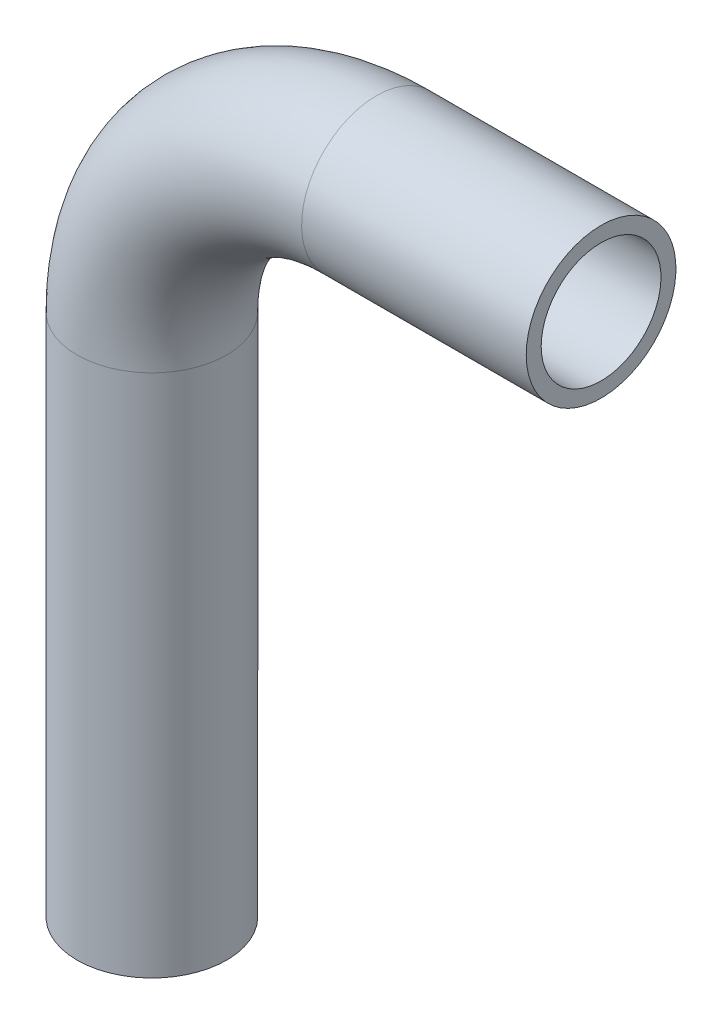
ISO-10303-21;
HEADER;
FILE_DESCRIPTION(('STEP AP214'),'2;1');
FILE_NAME('part.step','',(''),(''),'','','');
FILE_SCHEMA(('AUTOMOTIVE_DESIGN { 1 0 10303 214 1 1 1 1 }'));
ENDSEC;
DATA;
#1=APPLICATION_CONTEXT('core data for automotive mechanical design processes');
#2=APPLICATION_PROTOCOL_DEFINITION('international standard','automotive_design',2000,#1);
#3=PRODUCT_CONTEXT('',#1,'mechanical');
#4=PRODUCT('Part','Part','',(#3));
#5=PRODUCT_RELATED_PRODUCT_CATEGORY('part','',(#4));
#6=PRODUCT_DEFINITION_FORMATION('','',#4);
#7=PRODUCT_DEFINITION_CONTEXT('part definition',#1,'design');
#8=PRODUCT_DEFINITION('design','',#6,#7);
#9=PRODUCT_DEFINITION_SHAPE('','',#8);
#10=(LENGTH_UNIT() NAMED_UNIT(*) SI_UNIT(.MILLI.,.METRE.));
#11=(NAMED_UNIT(*) PLANE_ANGLE_UNIT() SI_UNIT($,.RADIAN.));
#12=(NAMED_UNIT(*) SI_UNIT($,.STERADIAN.) SOLID_ANGLE_UNIT());
#13=UNCERTAINTY_MEASURE_WITH_UNIT(LENGTH_MEASURE(1.E-05),#10,'distance_accuracy_value','');
#14=(GEOMETRIC_REPRESENTATION_CONTEXT(3) GLOBAL_UNCERTAINTY_ASSIGNED_CONTEXT((#13)) GLOBAL_UNIT_ASSIGNED_CONTEXT((#10,
#11,#12)) REPRESENTATION_CONTEXT('',''));
#15=CARTESIAN_POINT('',(0.,0.,0.));
#16=DIRECTION('',(0.,0.,1.));
#17=DIRECTION('',(1.,0.,0.));
#18=AXIS2_PLACEMENT_3D('',#15,#16,#17);
#19=CARTESIAN_POINT('',(0.,0.,0.));
#20=DIRECTION('',(0.,1.,0.));
#21=DIRECTION('',(0.,0.,1.));
#22=AXIS2_PLACEMENT_3D('',#19,#20,#21);
#23=CYLINDRICAL_SURFACE('',#22,12.7);
#24=CARTESIAN_POINT('',(0.,88.9,0.));
#25=DIRECTION('',(0.,1.,0.));
#26=DIRECTION('',(0.,0.,1.));
#27=AXIS2_PLACEMENT_3D('',#24,#25,#26);
#28=CIRCLE('',#27,12.7);
#29=CARTESIAN_POINT('',(-12.7,88.9,0.));
#30=VERTEX_POINT('',#29);
#31=EDGE_CURVE('E58',#30,#30,#28,.T.);
#32=ORIENTED_EDGE('',*,*,#31,.F.);
#33=EDGE_LOOP('',(#32));
#34=FACE_BOUND('',#33,.T.);
#35=CARTESIAN_POINT('',(0.,0.,0.));
#36=DIRECTION('',(0.,1.,0.));
#37=DIRECTION('',(0.,0.,1.));
#38=AXIS2_PLACEMENT_3D('',#35,#36,#37);
#39=CIRCLE('',#38,12.7);
#40=CARTESIAN_POINT('',(0.,0.,12.7));
#41=VERTEX_POINT('',#40);
#42=EDGE_CURVE('E56',#41,#41,#39,.T.);
#43=ORIENTED_EDGE('',*,*,#42,.T.);
#44=EDGE_LOOP('',(#43));
#45=FACE_BOUND('',#44,.T.);
#46=ADVANCED_FACE('F35',(#34,#45),#23,.T.);
#47=CARTESIAN_POINT('',(38.1,88.9,0.));
#48=DIRECTION('',(0.,0.,-1.));
#49=DIRECTION('',(-1.,0.,0.));
#50=AXIS2_PLACEMENT_3D('',#47,#48,#49);
#51=TOROIDAL_SURFACE('',#50,38.1,12.7);
#52=CARTESIAN_POINT('',(38.1,127.,0.));
#53=DIRECTION('',(1.,0.,0.));
#54=DIRECTION('',(0.,0.,1.));
#55=AXIS2_PLACEMENT_3D('',#52,#53,#54);
#56=CIRCLE('',#55,12.7);
#57=CARTESIAN_POINT('',(38.1,139.7,0.));
#58=VERTEX_POINT('',#57);
#59=EDGE_CURVE('E39',#58,#58,#56,.T.);
#60=CARTESIAN_POINT('',(38.1,88.9,0.));
#61=DIRECTION('',(0.,0.,-1.));
#62=DIRECTION('',(-1.,0.,0.));
#63=AXIS2_PLACEMENT_3D('',#60,#61,#62);
#64=CIRCLE('',#63,50.8);
#65=EDGE_CURVE('',#30,#58,#64,.T.);
#66=ORIENTED_EDGE('',*,*,#31,.T.);
#67=ORIENTED_EDGE('',*,*,#59,.F.);
#68=ORIENTED_EDGE('',*,*,#65,.T.);
#69=ORIENTED_EDGE('',*,*,#65,.F.);
#70=EDGE_LOOP('',(#66,#68,#67,#69));
#71=FACE_BOUND('',#70,.T.);
#72=ADVANCED_FACE('F66',(#71),#51,.T.);
#73=CARTESIAN_POINT('',(38.1,127.,0.));
#74=DIRECTION('',(1.,0.,0.));
#75=DIRECTION('',(0.,0.,-1.));
#76=AXIS2_PLACEMENT_3D('',#73,#74,#75);
#77=CYLINDRICAL_SURFACE('',#76,12.7);
#78=CARTESIAN_POINT('',(76.2,127.,0.));
#79=DIRECTION('',(1.,0.,0.));
#80=DIRECTION('',(0.,0.,1.));
#81=AXIS2_PLACEMENT_3D('',#78,#79,#80);
#82=CIRCLE('',#81,12.7);
#83=CARTESIAN_POINT('',(76.2,127.,12.7));
#84=VERTEX_POINT('',#83);
#85=EDGE_CURVE('E52',#84,#84,#82,.T.);
#86=ORIENTED_EDGE('',*,*,#85,.F.);
#87=EDGE_LOOP('',(#86));
#88=FACE_BOUND('',#87,.T.);
#89=ORIENTED_EDGE('',*,*,#59,.T.);
#90=EDGE_LOOP('',(#89));
#91=FACE_BOUND('',#90,.T.);
#92=ADVANCED_FACE('F37',(#88,#91),#77,.T.);
#93=CARTESIAN_POINT('',(0.,0.,0.));
#94=DIRECTION('',(0.,1.,0.));
#95=DIRECTION('',(0.,0.,1.));
#96=AXIS2_PLACEMENT_3D('',#93,#94,#95);
#97=PLANE('',#96);
#98=CARTESIAN_POINT('',(0.,0.,0.));
#99=DIRECTION('',(0.,1.,0.));
#100=DIRECTION('',(0.,0.,1.));
#101=AXIS2_PLACEMENT_3D('',#98,#99,#100);
#102=CIRCLE('',#101,10.16);
#103=CARTESIAN_POINT('',(0.,0.,10.16));
#104=VERTEX_POINT('',#103);
#105=EDGE_CURVE('E55',#104,#104,#102,.F.);
#106=ORIENTED_EDGE('',*,*,#105,.F.);
#107=EDGE_LOOP('',(#106));
#108=FACE_BOUND('',#107,.T.);
#109=ORIENTED_EDGE('',*,*,#42,.F.);
#110=EDGE_LOOP('',(#109));
#111=FACE_BOUND('',#110,.T.);
#112=ADVANCED_FACE('F72',(#108,#111),#97,.F.);
#113=CARTESIAN_POINT('',(76.2,127.,0.));
#114=DIRECTION('',(1.,0.,0.));
#115=DIRECTION('',(0.,0.,1.));
#116=AXIS2_PLACEMENT_3D('',#113,#114,#115);
#117=PLANE('',#116);
#118=CARTESIAN_POINT('',(76.2,127.,0.));
#119=DIRECTION('',(1.,0.,0.));
#120=DIRECTION('',(0.,0.,1.));
#121=AXIS2_PLACEMENT_3D('',#118,#119,#120);
#122=CIRCLE('',#121,10.16);
#123=CARTESIAN_POINT('',(76.2,127.,10.16));
#124=VERTEX_POINT('',#123);
#125=EDGE_CURVE('E10',#124,#124,#122,.F.);
#126=ORIENTED_EDGE('',*,*,#125,.T.);
#127=EDGE_LOOP('',(#126));
#128=FACE_BOUND('',#127,.T.);
#129=ORIENTED_EDGE('',*,*,#85,.T.);
#130=EDGE_LOOP('',(#129));
#131=FACE_BOUND('',#130,.T.);
#132=ADVANCED_FACE('F90',(#128,#131),#117,.T.);
#133=CARTESIAN_POINT('',(0.,0.,0.));
#134=DIRECTION('',(0.,1.,0.));
#135=DIRECTION('',(0.,0.,1.));
#136=AXIS2_PLACEMENT_3D('',#133,#134,#135);
#137=CYLINDRICAL_SURFACE('',#136,10.16);
#138=CARTESIAN_POINT('',(0.,88.9,0.));
#139=DIRECTION('',(0.,1.,0.));
#140=DIRECTION('',(0.,0.,1.));
#141=AXIS2_PLACEMENT_3D('',#138,#139,#140);
#142=CIRCLE('',#141,10.16);
#143=CARTESIAN_POINT('',(-10.16,88.9,0.));
#144=VERTEX_POINT('',#143);
#145=EDGE_CURVE('E48',#144,#144,#142,.F.);
#146=ORIENTED_EDGE('',*,*,#145,.F.);
#147=EDGE_LOOP('',(#146));
#148=FACE_BOUND('',#147,.T.);
#149=ORIENTED_EDGE('',*,*,#105,.T.);
#150=EDGE_LOOP('',(#149));
#151=FACE_BOUND('',#150,.T.);
#152=ADVANCED_FACE('F84',(#148,#151),#137,.F.);
#153=CARTESIAN_POINT('',(38.1,88.9,0.));
#154=DIRECTION('',(0.,0.,-1.));
#155=DIRECTION('',(-1.,0.,0.));
#156=AXIS2_PLACEMENT_3D('',#153,#154,#155);
#157=TOROIDAL_SURFACE('',#156,38.1,10.16);
#158=CARTESIAN_POINT('',(38.1,127.,0.));
#159=DIRECTION('',(1.,0.,0.));
#160=DIRECTION('',(0.,0.,1.));
#161=AXIS2_PLACEMENT_3D('',#158,#159,#160);
#162=CIRCLE('',#161,10.16);
#163=CARTESIAN_POINT('',(38.1,137.16,0.));
#164=VERTEX_POINT('',#163);
#165=EDGE_CURVE('E43',#164,#164,#162,.F.);
#166=CARTESIAN_POINT('',(38.1,88.9,0.));
#167=DIRECTION('',(0.,0.,-1.));
#168=DIRECTION('',(-1.,0.,0.));
#169=AXIS2_PLACEMENT_3D('',#166,#167,#168);
#170=CIRCLE('',#169,48.26);
#171=EDGE_CURVE('',#144,#164,#170,.T.);
#172=ORIENTED_EDGE('',*,*,#145,.T.);
#173=ORIENTED_EDGE('',*,*,#165,.F.);
#174=ORIENTED_EDGE('',*,*,#171,.T.);
#175=ORIENTED_EDGE('',*,*,#171,.F.);
#176=EDGE_LOOP('',(#172,#174,#173,#175));
#177=FACE_BOUND('',#176,.T.);
#178=ADVANCED_FACE('F78',(#177),#157,.F.);
#179=CARTESIAN_POINT('',(38.1,127.,0.));
#180=DIRECTION('',(1.,0.,0.));
#181=DIRECTION('',(0.,0.,-1.));
#182=AXIS2_PLACEMENT_3D('',#179,#180,#181);
#183=CYLINDRICAL_SURFACE('',#182,10.16);
#184=ORIENTED_EDGE('',*,*,#125,.F.);
#185=EDGE_LOOP('',(#184));
#186=FACE_BOUND('',#185,.T.);
#187=ORIENTED_EDGE('',*,*,#165,.T.);
#188=EDGE_LOOP('',(#187));
#189=FACE_BOUND('',#188,.T.);
#190=ADVANCED_FACE('F76',(#186,#189),#183,.F.);
#191=CLOSED_SHELL('',(#46,#72,#92,#112,#132,#152,#178,#190));
#192=MANIFOLD_SOLID_BREP('B2',#191);
#193=ADVANCED_BREP_SHAPE_REPRESENTATION('',(#18,#192),#14);
#194=SHAPE_DEFINITION_REPRESENTATION(#9,#193);
ENDSEC;
END-ISO-10303-21;
